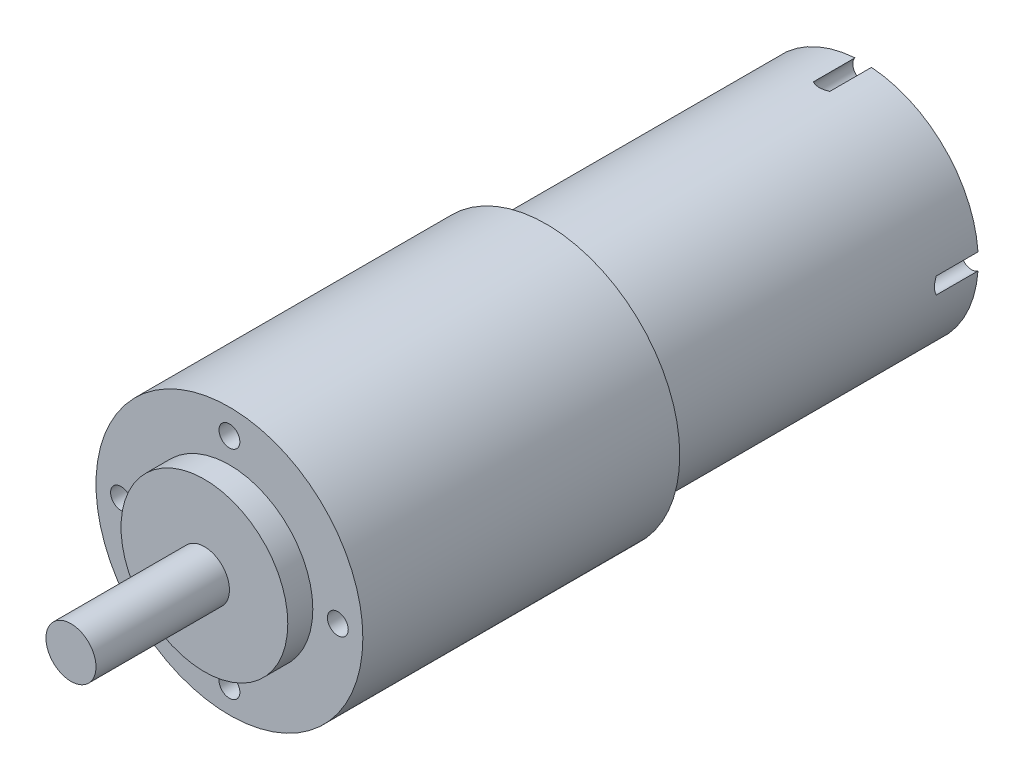
ISO-10303-21;
HEADER;
FILE_DESCRIPTION(('STEP AP214'),'2;1');
FILE_NAME('part.step','',(''),(''),'','','');
FILE_SCHEMA(('AUTOMOTIVE_DESIGN { 1 0 10303 214 1 1 1 1 }'));
ENDSEC;
DATA;
#1=APPLICATION_CONTEXT('core data for automotive mechanical design processes');
#2=APPLICATION_PROTOCOL_DEFINITION('international standard','automotive_design',2000,#1);
#3=PRODUCT_CONTEXT('',#1,'mechanical');
#4=PRODUCT('Part','Part','',(#3));
#5=PRODUCT_RELATED_PRODUCT_CATEGORY('part','',(#4));
#6=PRODUCT_DEFINITION_FORMATION('','',#4);
#7=PRODUCT_DEFINITION_CONTEXT('part definition',#1,'design');
#8=PRODUCT_DEFINITION('design','',#6,#7);
#9=PRODUCT_DEFINITION_SHAPE('','',#8);
#10=(LENGTH_UNIT() NAMED_UNIT(*) SI_UNIT(.MILLI.,.METRE.));
#11=(NAMED_UNIT(*) PLANE_ANGLE_UNIT() SI_UNIT($,.RADIAN.));
#12=(NAMED_UNIT(*) SI_UNIT($,.STERADIAN.) SOLID_ANGLE_UNIT());
#13=UNCERTAINTY_MEASURE_WITH_UNIT(LENGTH_MEASURE(1.E-05),#10,'distance_accuracy_value','');
#14=(GEOMETRIC_REPRESENTATION_CONTEXT(3) GLOBAL_UNCERTAINTY_ASSIGNED_CONTEXT((#13)) GLOBAL_UNIT_ASSIGNED_CONTEXT((#10,
#11,#12)) REPRESENTATION_CONTEXT('',''));
#15=CARTESIAN_POINT('',(0.,0.,0.));
#16=DIRECTION('',(0.,0.,1.));
#17=DIRECTION('',(1.,0.,0.));
#18=AXIS2_PLACEMENT_3D('',#15,#16,#17);
#19=CARTESIAN_POINT('',(0.,0.,38.));
#20=DIRECTION('',(0.,0.,-1.));
#21=DIRECTION('',(-1.,0.,0.));
#22=AXIS2_PLACEMENT_3D('',#19,#20,#21);
#23=CYLINDRICAL_SURFACE('',#22,16.);
#24=CARTESIAN_POINT('',(0.,0.,38.));
#25=DIRECTION('',(0.,0.,1.));
#26=DIRECTION('',(1.,0.,0.));
#27=AXIS2_PLACEMENT_3D('',#24,#25,#26);
#28=CIRCLE('',#27,16.);
#29=CARTESIAN_POINT('',(16.,0.,38.));
#30=VERTEX_POINT('',#29);
#31=EDGE_CURVE('E229',#30,#30,#28,.T.);
#32=ORIENTED_EDGE('',*,*,#31,.F.);
#33=EDGE_LOOP('',(#32));
#34=FACE_BOUND('',#33,.T.);
#35=CARTESIAN_POINT('',(0.,0.,0.));
#36=DIRECTION('',(0.,0.,1.));
#37=DIRECTION('',(1.,0.,0.));
#38=AXIS2_PLACEMENT_3D('',#35,#36,#37);
#39=CIRCLE('',#38,16.);
#40=CARTESIAN_POINT('',(16.,0.,0.));
#41=VERTEX_POINT('',#40);
#42=EDGE_CURVE('E224',#41,#41,#39,.T.);
#43=ORIENTED_EDGE('',*,*,#42,.T.);
#44=EDGE_LOOP('',(#43));
#45=FACE_BOUND('',#44,.T.);
#46=ADVANCED_FACE('F40',(#34,#45),#23,.T.);
#47=CARTESIAN_POINT('',(0.,0.,38.));
#48=DIRECTION('',(0.,0.,1.));
#49=DIRECTION('',(1.,0.,0.));
#50=AXIS2_PLACEMENT_3D('',#47,#48,#49);
#51=PLANE('',#50);
#52=CARTESIAN_POINT('',(0.,13.,38.));
#53=DIRECTION('',(0.,0.,1.));
#54=DIRECTION('',(1.,0.,0.));
#55=AXIS2_PLACEMENT_3D('',#52,#53,#54);
#56=CIRCLE('',#55,1.24999999999999);
#57=CARTESIAN_POINT('',(1.24999999999999,13.,38.));
#58=VERTEX_POINT('',#57);
#59=EDGE_CURVE('E139',#58,#58,#56,.T.);
#60=ORIENTED_EDGE('',*,*,#59,.F.);
#61=EDGE_LOOP('',(#60));
#62=FACE_BOUND('',#61,.T.);
#63=CARTESIAN_POINT('',(-13.,0.,38.));
#64=DIRECTION('',(0.,0.,1.));
#65=DIRECTION('',(1.,0.,0.));
#66=AXIS2_PLACEMENT_3D('',#63,#64,#65);
#67=CIRCLE('',#66,1.24999999999999);
#68=CARTESIAN_POINT('',(-11.75,0.,38.));
#69=VERTEX_POINT('',#68);
#70=EDGE_CURVE('E138',#69,#69,#67,.T.);
#71=ORIENTED_EDGE('',*,*,#70,.F.);
#72=EDGE_LOOP('',(#71));
#73=FACE_BOUND('',#72,.T.);
#74=CARTESIAN_POINT('',(0.,-13.,38.));
#75=DIRECTION('',(0.,0.,1.));
#76=DIRECTION('',(1.,0.,0.));
#77=AXIS2_PLACEMENT_3D('',#74,#75,#76);
#78=CIRCLE('',#77,1.24999999999999);
#79=CARTESIAN_POINT('',(1.24999999999999,-13.,38.));
#80=VERTEX_POINT('',#79);
#81=EDGE_CURVE('E152',#80,#80,#78,.T.);
#82=ORIENTED_EDGE('',*,*,#81,.F.);
#83=EDGE_LOOP('',(#82));
#84=FACE_BOUND('',#83,.T.);
#85=CARTESIAN_POINT('',(13.,0.,38.));
#86=DIRECTION('',(0.,0.,1.));
#87=DIRECTION('',(1.,0.,0.));
#88=AXIS2_PLACEMENT_3D('',#85,#86,#87);
#89=CIRCLE('',#88,1.24999999999999);
#90=CARTESIAN_POINT('',(14.25,0.,38.));
#91=VERTEX_POINT('',#90);
#92=EDGE_CURVE('E160',#91,#91,#89,.T.);
#93=ORIENTED_EDGE('',*,*,#92,.F.);
#94=EDGE_LOOP('',(#93));
#95=FACE_BOUND('',#94,.T.);
#96=CARTESIAN_POINT('',(0.,0.,38.));
#97=DIRECTION('',(0.,0.,1.));
#98=DIRECTION('',(1.,0.,0.));
#99=AXIS2_PLACEMENT_3D('',#96,#97,#98);
#100=CIRCLE('',#99,10.);
#101=CARTESIAN_POINT('',(10.,0.,38.));
#102=VERTEX_POINT('',#101);
#103=EDGE_CURVE('E203',#102,#102,#100,.T.);
#104=ORIENTED_EDGE('',*,*,#103,.F.);
#105=EDGE_LOOP('',(#104));
#106=FACE_BOUND('',#105,.T.);
#107=ORIENTED_EDGE('',*,*,#31,.T.);
#108=EDGE_LOOP('',(#107));
#109=FACE_BOUND('',#108,.T.);
#110=ADVANCED_FACE('F294',(#62,#73,#84,#95,#106,#109),#51,.T.);
#111=CARTESIAN_POINT('',(0.,0.,0.));
#112=DIRECTION('',(0.,0.,1.));
#113=DIRECTION('',(1.,0.,0.));
#114=AXIS2_PLACEMENT_3D('',#111,#112,#113);
#115=PLANE('',#114);
#116=CARTESIAN_POINT('',(0.,0.,0.));
#117=DIRECTION('',(0.,0.,-1.));
#118=DIRECTION('',(-1.,0.,0.));
#119=AXIS2_PLACEMENT_3D('',#116,#117,#118);
#120=CIRCLE('',#119,13.8);
#121=CARTESIAN_POINT('',(-13.8,0.,0.));
#122=VERTEX_POINT('',#121);
#123=EDGE_CURVE('E219',#122,#122,#120,.T.);
#124=ORIENTED_EDGE('',*,*,#123,.F.);
#125=EDGE_LOOP('',(#124));
#126=FACE_BOUND('',#125,.T.);
#127=ORIENTED_EDGE('',*,*,#42,.F.);
#128=EDGE_LOOP('',(#127));
#129=FACE_BOUND('',#128,.T.);
#130=ADVANCED_FACE('F289',(#126,#129),#115,.F.);
#131=CARTESIAN_POINT('',(0.,0.,-38.));
#132=DIRECTION('',(0.,0.,1.));
#133=DIRECTION('',(1.,0.,0.));
#134=AXIS2_PLACEMENT_3D('',#131,#132,#133);
#135=CYLINDRICAL_SURFACE('',#134,13.8);
#136=CARTESIAN_POINT('',(13.7644872211333,-0.989389478040929,-33.0002));
#137=CARTESIAN_POINT('',(13.7665664823169,-0.96046106691949,-32.9872119820903));
#138=CARTESIAN_POINT('',(13.7685608504874,-0.931441624871401,-32.9744136159397));
#139=CARTESIAN_POINT('',(13.7723782546518,-0.873183878608035,-32.9492818372111));
#140=CARTESIAN_POINT('',(13.7742012543098,-0.843945529389668,-32.9369485235702));
#141=CARTESIAN_POINT('',(13.7794254944871,-0.755596743386906,-32.9006725704353));
#142=CARTESIAN_POINT('',(13.7825629092403,-0.696116670041222,-32.8775743899159));
#143=CARTESIAN_POINT('',(13.7880886154033,-0.5763512794133,-32.8348630581675));
#144=CARTESIAN_POINT('',(13.7904821849893,-0.516074954895346,-32.8152258011119));
#145=CARTESIAN_POINT('',(13.794503992416,-0.394165477002278,-32.78085365232));
#146=CARTESIAN_POINT('',(13.7961335456822,-0.332534848375913,-32.7661103474255));
#147=CARTESIAN_POINT('',(13.798243605324,-0.224809881104407,-32.7465365842829));
#148=CARTESIAN_POINT('',(13.7989156010823,-0.179016334825304,-32.7401041459718));
#149=CARTESIAN_POINT('',(13.7998022181188,-0.0870188840995497,-32.7315600219018));
#150=CARTESIAN_POINT('',(13.8000169555805,-0.040815086889218,-32.7294472385797));
#151=CARTESIAN_POINT('',(13.7999809458002,0.0515783069470431,-32.7297986950174));
#152=CARTESIAN_POINT('',(13.7997301571976,0.0977679019464777,-32.7322633414677));
#153=CARTESIAN_POINT('',(13.7987726393195,0.1897097360966,-32.7414712865933));
#154=CARTESIAN_POINT('',(13.7980657816826,0.235461848437034,-32.7482157898315));
#155=CARTESIAN_POINT('',(13.795892516883,0.342223702713093,-32.7682979915394));
#156=CARTESIAN_POINT('',(13.7942464793929,0.40294484983478,-32.783119776325));
#157=CARTESIAN_POINT('',(13.7902146312648,0.523070959201166,-32.8174384296429));
#158=CARTESIAN_POINT('',(13.7878276597291,0.582473698160168,-32.8369426236459));
#159=CARTESIAN_POINT('',(13.7823388612132,0.700459709458859,-32.8792373736964));
#160=CARTESIAN_POINT('',(13.7792327059807,0.759035645111527,-32.9020475017032));
#161=CARTESIAN_POINT('',(13.7740703612279,0.846064241797032,-32.9378380348218));
#162=CARTESIAN_POINT('',(13.7722700867784,0.874874166985876,-32.9500032366427));
#163=CARTESIAN_POINT('',(13.7685030780033,0.932282020714026,-32.9747842441915));
#164=CARTESIAN_POINT('',(13.7665363769739,0.960879990418931,-32.9873999594968));
#165=CARTESIAN_POINT('',(13.7644872211333,0.989389478040927,-33.0002));
#166=B_SPLINE_CURVE_WITH_KNOTS('',3,(#136,#137,#138,#139,#140,#141,#142,#143,#144,#145,#146,
#147,#148,#149,#150,#151,#152,#153,#154,#155,#156,#157,#158,#159,#160,#161,#162,#163,#164,#165),
.UNSPECIFIED.,.F.,.F.,(4,2,2,2,2,2,2,2,2,2,2,2,2,2,4),(0.,0.0953331030288682,0.190686374476015,
0.382265143548266,0.572451714729412,0.762309623545797,0.900876832462357,1.03940882903315,
1.177953134329,1.3165364501364,1.50382257949645,1.69140364327716,1.88014439868571,
1.9741159195618,2.06806868425706),.UNSPECIFIED.);
#167=CARTESIAN_POINT('',(13.7645192307692,-0.98894405594251,-33.));
#168=VERTEX_POINT('',#167);
#169=CARTESIAN_POINT('',(13.7645192307692,0.98894405594251,-33.));
#170=VERTEX_POINT('',#169);
#171=EDGE_CURVE('E484',#168,#170,#166,.T.);
#172=ORIENTED_EDGE('',*,*,#171,.T.);
#173=DIRECTION('',(0.,0.,-1.));
#174=VECTOR('',#173,1.);
#175=CARTESIAN_POINT('',(13.7645192307692,0.98894405594251,-35.5));
#176=LINE('',#175,#174);
#177=CARTESIAN_POINT('',(13.7645192307692,0.988944055942509,-38.));
#178=VERTEX_POINT('',#177);
#179=EDGE_CURVE('E11',#170,#178,#176,.T.);
#180=ORIENTED_EDGE('',*,*,#179,.T.);
#181=CARTESIAN_POINT('',(0.,0.,-38.));
#182=DIRECTION('',(0.,0.,-1.));
#183=DIRECTION('',(-1.,0.,0.));
#184=AXIS2_PLACEMENT_3D('',#181,#182,#183);
#185=CIRCLE('',#184,13.8);
#186=CARTESIAN_POINT('',(0.988944055942509,13.7645192307692,-38.));
#187=VERTEX_POINT('',#186);
#188=EDGE_CURVE('E220',#187,#178,#185,.T.);
#189=ORIENTED_EDGE('',*,*,#188,.F.);
#190=DIRECTION('',(0.,0.,-1.));
#191=VECTOR('',#190,1.);
#192=CARTESIAN_POINT('',(0.98894405594251,13.7645192307692,-35.5));
#193=LINE('',#192,#191);
#194=CARTESIAN_POINT('',(0.988944055942509,13.7645192307692,-33.));
#195=VERTEX_POINT('',#194);
#196=EDGE_CURVE('E245',#187,#195,#193,.F.);
#197=ORIENTED_EDGE('',*,*,#196,.T.);
#198=CARTESIAN_POINT('',(0.989389478040928,13.7644872211333,-33.0002));
#199=CARTESIAN_POINT('',(0.960461066919489,13.7665664823169,-32.9872119820903));
#200=CARTESIAN_POINT('',(0.931441624871401,13.7685608504874,-32.9744136159397));
#201=CARTESIAN_POINT('',(0.873183878608035,13.7723782546518,-32.9492818372111));
#202=CARTESIAN_POINT('',(0.843945529389668,13.7742012543098,-32.9369485235702));
#203=CARTESIAN_POINT('',(0.755596743386906,13.7794254944871,-32.9006725704353));
#204=CARTESIAN_POINT('',(0.696116670041223,13.7825629092403,-32.8775743899159));
#205=CARTESIAN_POINT('',(0.576351279413301,13.7880886154033,-32.8348630581675));
#206=CARTESIAN_POINT('',(0.516074954895348,13.7904821849893,-32.8152258011119));
#207=CARTESIAN_POINT('',(0.394165477002281,13.794503992416,-32.78085365232));
#208=CARTESIAN_POINT('',(0.332534848375915,13.7961335456822,-32.7661103474255));
#209=CARTESIAN_POINT('',(0.224809881104409,13.798243605324,-32.7465365842829));
#210=CARTESIAN_POINT('',(0.179016334825306,13.7989156010823,-32.7401041459718));
#211=CARTESIAN_POINT('',(0.0870188840995515,13.7998022181188,-32.7315600219018));
#212=CARTESIAN_POINT('',(0.0408150868892199,13.8000169555805,-32.7294472385797));
#213=CARTESIAN_POINT('',(-0.0515783069470414,13.7999809458002,-32.7297986950174));
#214=CARTESIAN_POINT('',(-0.0977679019464761,13.7997301571976,-32.7322633414677));
#215=CARTESIAN_POINT('',(-0.189709736096598,13.7987726393195,-32.7414712865933));
#216=CARTESIAN_POINT('',(-0.235461848437032,13.7980657816826,-32.7482157898315));
#217=CARTESIAN_POINT('',(-0.342223702713091,13.795892516883,-32.7682979915394));
#218=CARTESIAN_POINT('',(-0.402944849834779,13.7942464793929,-32.783119776325));
#219=CARTESIAN_POINT('',(-0.523070959201166,13.7902146312648,-32.8174384296429));
#220=CARTESIAN_POINT('',(-0.582473698160169,13.7878276597291,-32.8369426236459));
#221=CARTESIAN_POINT('',(-0.70045970945886,13.7823388612132,-32.8792373736964));
#222=CARTESIAN_POINT('',(-0.759035645111527,13.7792327059807,-32.9020475017032));
#223=CARTESIAN_POINT('',(-0.846064241797032,13.7740703612279,-32.9378380348218));
#224=CARTESIAN_POINT('',(-0.874874166985876,13.7722700867784,-32.9500032366427));
#225=CARTESIAN_POINT('',(-0.932282020714026,13.7685030780033,-32.9747842441915));
#226=CARTESIAN_POINT('',(-0.96087999041893,13.7665363769739,-32.9873999594968));
#227=CARTESIAN_POINT('',(-0.989389478040927,13.7644872211333,-33.0002));
#228=B_SPLINE_CURVE_WITH_KNOTS('',3,(#198,#199,#200,#201,#202,#203,#204,#205,#206,#207,#208,
#209,#210,#211,#212,#213,#214,#215,#216,#217,#218,#219,#220,#221,#222,#223,#224,#225,#226,#227),
.UNSPECIFIED.,.F.,.F.,(4,2,2,2,2,2,2,2,2,2,2,2,2,2,4),(0.,0.095333103028868,0.190686374476015,
0.382265143548266,0.572451714729408,0.762309623545795,0.900876832462355,1.03940882903315,
1.177953134329,1.3165364501364,1.50382257949645,1.69140364327716,1.88014439868571,
1.9741159195618,2.06806868425706),.UNSPECIFIED.);
#229=CARTESIAN_POINT('',(-0.988944055942509,13.7645192307692,-33.));
#230=VERTEX_POINT('',#229);
#231=EDGE_CURVE('E202',#195,#230,#228,.T.);
#232=ORIENTED_EDGE('',*,*,#231,.T.);
#233=DIRECTION('',(0.,0.,-1.));
#234=VECTOR('',#233,1.);
#235=CARTESIAN_POINT('',(-0.98894405594251,13.7645192307692,-35.5));
#236=LINE('',#235,#234);
#237=CARTESIAN_POINT('',(-0.988944055942509,13.7645192307692,-38.));
#238=VERTEX_POINT('',#237);
#239=EDGE_CURVE('E505',#230,#238,#236,.T.);
#240=ORIENTED_EDGE('',*,*,#239,.T.);
#241=CARTESIAN_POINT('',(-13.7645192307692,0.988944055942509,-38.));
#242=VERTEX_POINT('',#241);
#243=EDGE_CURVE('E215',#242,#238,#185,.T.);
#244=ORIENTED_EDGE('',*,*,#243,.F.);
#245=DIRECTION('',(0.,0.,-1.));
#246=VECTOR('',#245,1.);
#247=CARTESIAN_POINT('',(-13.7645192307692,0.98894405594251,-35.5));
#248=LINE('',#247,#246);
#249=CARTESIAN_POINT('',(-13.7645192307692,0.98894405594251,-33.));
#250=VERTEX_POINT('',#249);
#251=EDGE_CURVE('E512',#242,#250,#248,.F.);
#252=ORIENTED_EDGE('',*,*,#251,.T.);
#253=CARTESIAN_POINT('',(-13.7644872211333,0.989389478040929,-33.0002));
#254=CARTESIAN_POINT('',(-13.7665664823169,0.96046106691949,-32.9872119820903));
#255=CARTESIAN_POINT('',(-13.7685608504874,0.931441624871401,-32.9744136159397));
#256=CARTESIAN_POINT('',(-13.7723782546518,0.873183878608035,-32.9492818372111));
#257=CARTESIAN_POINT('',(-13.7742012543098,0.843945529389668,-32.9369485235702));
#258=CARTESIAN_POINT('',(-13.7794254944871,0.755596743386906,-32.9006725704353));
#259=CARTESIAN_POINT('',(-13.7825629092403,0.696116670041222,-32.8775743899159));
#260=CARTESIAN_POINT('',(-13.7880886154033,0.5763512794133,-32.8348630581675));
#261=CARTESIAN_POINT('',(-13.7904821849893,0.516074954895346,-32.8152258011119));
#262=CARTESIAN_POINT('',(-13.794503992416,0.394165477002278,-32.78085365232));
#263=CARTESIAN_POINT('',(-13.7961335456822,0.332534848375913,-32.7661103474255));
#264=CARTESIAN_POINT('',(-13.798243605324,0.224809881104407,-32.7465365842829));
#265=CARTESIAN_POINT('',(-13.7989156010823,0.179016334825304,-32.7401041459718));
#266=CARTESIAN_POINT('',(-13.7998022181188,0.0870188840995497,-32.7315600219018));
#267=CARTESIAN_POINT('',(-13.8000169555805,0.040815086889218,-32.7294472385797));
#268=CARTESIAN_POINT('',(-13.7999809458002,-0.0515783069470431,-32.7297986950174));
#269=CARTESIAN_POINT('',(-13.7997301571976,-0.0977679019464777,-32.7322633414677));
#270=CARTESIAN_POINT('',(-13.7987726393195,-0.1897097360966,-32.7414712865933));
#271=CARTESIAN_POINT('',(-13.7980657816826,-0.235461848437034,-32.7482157898315));
#272=CARTESIAN_POINT('',(-13.795892516883,-0.342223702713093,-32.7682979915394));
#273=CARTESIAN_POINT('',(-13.7942464793929,-0.40294484983478,-32.783119776325));
#274=CARTESIAN_POINT('',(-13.7902146312648,-0.523070959201166,-32.8174384296429));
#275=CARTESIAN_POINT('',(-13.7878276597291,-0.582473698160168,-32.8369426236459));
#276=CARTESIAN_POINT('',(-13.7823388612132,-0.700459709458859,-32.8792373736964));
#277=CARTESIAN_POINT('',(-13.7792327059807,-0.759035645111527,-32.9020475017032));
#278=CARTESIAN_POINT('',(-13.7740703612279,-0.846064241797032,-32.9378380348218));
#279=CARTESIAN_POINT('',(-13.7722700867784,-0.874874166985876,-32.9500032366427));
#280=CARTESIAN_POINT('',(-13.7685030780033,-0.932282020714026,-32.9747842441915));
#281=CARTESIAN_POINT('',(-13.7665363769739,-0.960879990418931,-32.9873999594968));
#282=CARTESIAN_POINT('',(-13.7644872211333,-0.989389478040927,-33.0002));
#283=B_SPLINE_CURVE_WITH_KNOTS('',3,(#253,#254,#255,#256,#257,#258,#259,#260,#261,#262,#263,
#264,#265,#266,#267,#268,#269,#270,#271,#272,#273,#274,#275,#276,#277,#278,#279,#280,#281,#282),
.UNSPECIFIED.,.F.,.F.,(4,2,2,2,2,2,2,2,2,2,2,2,2,2,4),(0.,0.0953331030288682,0.190686374476015,
0.382265143548266,0.572451714729412,0.762309623545797,0.900876832462357,1.03940882903315,
1.177953134329,1.3165364501364,1.50382257949645,1.69140364327716,1.88014439868571,
1.9741159195618,2.06806868425706),.UNSPECIFIED.);
#284=CARTESIAN_POINT('',(-13.7645192307692,-0.98894405594251,-33.));
#285=VERTEX_POINT('',#284);
#286=EDGE_CURVE('E507',#250,#285,#283,.T.);
#287=ORIENTED_EDGE('',*,*,#286,.T.);
#288=DIRECTION('',(0.,0.,-1.));
#289=VECTOR('',#288,1.);
#290=CARTESIAN_POINT('',(-13.7645192307692,-0.98894405594251,-35.5));
#291=LINE('',#290,#289);
#292=CARTESIAN_POINT('',(-13.7645192307692,-0.988944055942509,-38.));
#293=VERTEX_POINT('',#292);
#294=EDGE_CURVE('E533',#285,#293,#291,.T.);
#295=ORIENTED_EDGE('',*,*,#294,.T.);
#296=CARTESIAN_POINT('',(-0.988944055942509,-13.7645192307692,-38.));
#297=VERTEX_POINT('',#296);
#298=EDGE_CURVE('E539',#297,#293,#185,.T.);
#299=ORIENTED_EDGE('',*,*,#298,.F.);
#300=DIRECTION('',(0.,0.,-1.));
#301=VECTOR('',#300,1.);
#302=CARTESIAN_POINT('',(-0.98894405594251,-13.7645192307692,-35.5));
#303=LINE('',#302,#301);
#304=CARTESIAN_POINT('',(-0.988944055942509,-13.7645192307692,-33.));
#305=VERTEX_POINT('',#304);
#306=EDGE_CURVE('E532',#297,#305,#303,.F.);
#307=ORIENTED_EDGE('',*,*,#306,.T.);
#308=CARTESIAN_POINT('',(-0.989389478040928,-13.7644872211333,-33.0002));
#309=CARTESIAN_POINT('',(-0.960461066919489,-13.7665664823169,-32.9872119820903));
#310=CARTESIAN_POINT('',(-0.931441624871401,-13.7685608504874,-32.9744136159397));
#311=CARTESIAN_POINT('',(-0.873183878608035,-13.7723782546518,-32.9492818372111));
#312=CARTESIAN_POINT('',(-0.843945529389668,-13.7742012543098,-32.9369485235702));
#313=CARTESIAN_POINT('',(-0.755596743386906,-13.7794254944871,-32.9006725704353));
#314=CARTESIAN_POINT('',(-0.696116670041223,-13.7825629092403,-32.8775743899159));
#315=CARTESIAN_POINT('',(-0.576351279413301,-13.7880886154033,-32.8348630581675));
#316=CARTESIAN_POINT('',(-0.516074954895348,-13.7904821849893,-32.8152258011119));
#317=CARTESIAN_POINT('',(-0.394165477002281,-13.794503992416,-32.78085365232));
#318=CARTESIAN_POINT('',(-0.332534848375915,-13.7961335456822,-32.7661103474255));
#319=CARTESIAN_POINT('',(-0.224809881104409,-13.798243605324,-32.7465365842829));
#320=CARTESIAN_POINT('',(-0.179016334825306,-13.7989156010823,-32.7401041459718));
#321=CARTESIAN_POINT('',(-0.0870188840995515,-13.7998022181188,-32.7315600219018));
#322=CARTESIAN_POINT('',(-0.0408150868892199,-13.8000169555805,-32.7294472385797));
#323=CARTESIAN_POINT('',(0.0515783069470414,-13.7999809458002,-32.7297986950174));
#324=CARTESIAN_POINT('',(0.0977679019464761,-13.7997301571976,-32.7322633414677));
#325=CARTESIAN_POINT('',(0.189709736096598,-13.7987726393195,-32.7414712865933));
#326=CARTESIAN_POINT('',(0.235461848437032,-13.7980657816826,-32.7482157898315));
#327=CARTESIAN_POINT('',(0.342223702713091,-13.795892516883,-32.7682979915394));
#328=CARTESIAN_POINT('',(0.402944849834779,-13.7942464793929,-32.783119776325));
#329=CARTESIAN_POINT('',(0.523070959201166,-13.7902146312648,-32.8174384296429));
#330=CARTESIAN_POINT('',(0.582473698160169,-13.7878276597291,-32.8369426236459));
#331=CARTESIAN_POINT('',(0.70045970945886,-13.7823388612132,-32.8792373736964));
#332=CARTESIAN_POINT('',(0.759035645111527,-13.7792327059807,-32.9020475017032));
#333=CARTESIAN_POINT('',(0.846064241797032,-13.7740703612279,-32.9378380348218));
#334=CARTESIAN_POINT('',(0.874874166985876,-13.7722700867784,-32.9500032366427));
#335=CARTESIAN_POINT('',(0.932282020714026,-13.7685030780033,-32.9747842441915));
#336=CARTESIAN_POINT('',(0.96087999041893,-13.7665363769739,-32.9873999594968));
#337=CARTESIAN_POINT('',(0.989389478040927,-13.7644872211333,-33.0002));
#338=B_SPLINE_CURVE_WITH_KNOTS('',3,(#308,#309,#310,#311,#312,#313,#314,#315,#316,#317,#318,
#319,#320,#321,#322,#323,#324,#325,#326,#327,#328,#329,#330,#331,#332,#333,#334,#335,#336,#337),
.UNSPECIFIED.,.F.,.F.,(4,2,2,2,2,2,2,2,2,2,2,2,2,2,4),(0.,0.095333103028868,0.190686374476015,
0.382265143548266,0.572451714729408,0.762309623545795,0.900876832462355,1.03940882903315,
1.177953134329,1.3165364501364,1.50382257949645,1.69140364327716,1.88014439868571,
1.9741159195618,2.06806868425706),.UNSPECIFIED.);
#339=CARTESIAN_POINT('',(0.988944055942509,-13.7645192307692,-33.));
#340=VERTEX_POINT('',#339);
#341=EDGE_CURVE('E525',#305,#340,#338,.T.);
#342=ORIENTED_EDGE('',*,*,#341,.T.);
#343=DIRECTION('',(0.,0.,-1.));
#344=VECTOR('',#343,1.);
#345=CARTESIAN_POINT('',(0.98894405594251,-13.7645192307692,-35.5));
#346=LINE('',#345,#344);
#347=CARTESIAN_POINT('',(0.98894405594251,-13.7645192307692,-38.));
#348=VERTEX_POINT('',#347);
#349=EDGE_CURVE('E492',#340,#348,#346,.T.);
#350=ORIENTED_EDGE('',*,*,#349,.T.);
#351=CARTESIAN_POINT('',(13.7645192307692,-0.988944055942509,-38.));
#352=VERTEX_POINT('',#351);
#353=EDGE_CURVE('E225',#352,#348,#185,.T.);
#354=ORIENTED_EDGE('',*,*,#353,.F.);
#355=DIRECTION('',(0.,0.,-1.));
#356=VECTOR('',#355,1.);
#357=CARTESIAN_POINT('',(13.7645192307692,-0.98894405594251,-35.5));
#358=LINE('',#357,#356);
#359=EDGE_CURVE('E48',#352,#168,#358,.F.);
#360=ORIENTED_EDGE('',*,*,#359,.T.);
#361=EDGE_LOOP('',(#172,#180,#189,#197,#232,#240,#244,#252,#287,#295,#299,#307,#342,#350,#354,#360));
#362=FACE_BOUND('',#361,.T.);
#363=ORIENTED_EDGE('',*,*,#123,.T.);
#364=EDGE_LOOP('',(#363));
#365=FACE_BOUND('',#364,.T.);
#366=ADVANCED_FACE('F247',(#362,#365),#135,.T.);
#367=CARTESIAN_POINT('',(0.,0.,-38.));
#368=DIRECTION('',(0.,0.,-1.));
#369=DIRECTION('',(-1.,0.,0.));
#370=AXIS2_PLACEMENT_3D('',#367,#368,#369);
#371=PLANE('',#370);
#372=CARTESIAN_POINT('',(13.,0.,-38.));
#373=DIRECTION('',(0.,0.,-1.));
#374=DIRECTION('',(-1.,0.,0.));
#375=AXIS2_PLACEMENT_3D('',#372,#373,#374);
#376=CIRCLE('',#375,1.25);
#377=EDGE_CURVE('E168',#352,#178,#376,.T.);
#378=ORIENTED_EDGE('',*,*,#377,.F.);
#379=ORIENTED_EDGE('',*,*,#353,.T.);
#380=CARTESIAN_POINT('',(0.,-13.,-38.));
#381=DIRECTION('',(0.,0.,-1.));
#382=DIRECTION('',(-1.,0.,0.));
#383=AXIS2_PLACEMENT_3D('',#380,#381,#382);
#384=CIRCLE('',#383,1.25);
#385=EDGE_CURVE('E173',#297,#348,#384,.T.);
#386=ORIENTED_EDGE('',*,*,#385,.F.);
#387=ORIENTED_EDGE('',*,*,#298,.T.);
#388=CARTESIAN_POINT('',(-13.,0.,-38.));
#389=DIRECTION('',(0.,0.,-1.));
#390=DIRECTION('',(-1.,0.,0.));
#391=AXIS2_PLACEMENT_3D('',#388,#389,#390);
#392=CIRCLE('',#391,1.25);
#393=EDGE_CURVE('E179',#242,#293,#392,.T.);
#394=ORIENTED_EDGE('',*,*,#393,.F.);
#395=ORIENTED_EDGE('',*,*,#243,.T.);
#396=CARTESIAN_POINT('',(0.,13.,-38.));
#397=DIRECTION('',(0.,0.,-1.));
#398=DIRECTION('',(-1.,0.,0.));
#399=AXIS2_PLACEMENT_3D('',#396,#397,#398);
#400=CIRCLE('',#399,1.25);
#401=EDGE_CURVE('E186',#187,#238,#400,.T.);
#402=ORIENTED_EDGE('',*,*,#401,.F.);
#403=ORIENTED_EDGE('',*,*,#188,.T.);
#404=EDGE_LOOP('',(#378,#379,#386,#387,#394,#395,#402,#403));
#405=FACE_BOUND('',#404,.T.);
#406=CARTESIAN_POINT('',(0.,0.,-38.));
#407=DIRECTION('',(0.,0.,-1.));
#408=DIRECTION('',(-1.,0.,0.));
#409=AXIS2_PLACEMENT_3D('',#406,#407,#408);
#410=CIRCLE('',#409,5.);
#411=CARTESIAN_POINT('',(-5.,0.,-38.));
#412=VERTEX_POINT('',#411);
#413=EDGE_CURVE('E211',#412,#412,#410,.T.);
#414=ORIENTED_EDGE('',*,*,#413,.F.);
#415=EDGE_LOOP('',(#414));
#416=FACE_BOUND('',#415,.T.);
#417=ADVANCED_FACE('F282',(#405,#416),#371,.T.);
#418=CARTESIAN_POINT('',(0.,0.,-40.));
#419=DIRECTION('',(0.,0.,1.));
#420=DIRECTION('',(1.,0.,0.));
#421=AXIS2_PLACEMENT_3D('',#418,#419,#420);
#422=CYLINDRICAL_SURFACE('',#421,5.);
#423=CARTESIAN_POINT('',(0.,0.,-40.));
#424=DIRECTION('',(0.,0.,-1.));
#425=DIRECTION('',(-1.,0.,0.));
#426=AXIS2_PLACEMENT_3D('',#423,#424,#425);
#427=CIRCLE('',#426,5.);
#428=CARTESIAN_POINT('',(-5.,0.,-40.));
#429=VERTEX_POINT('',#428);
#430=EDGE_CURVE('E207',#429,#429,#427,.T.);
#431=ORIENTED_EDGE('',*,*,#430,.F.);
#432=EDGE_LOOP('',(#431));
#433=FACE_BOUND('',#432,.T.);
#434=ORIENTED_EDGE('',*,*,#413,.T.);
#435=EDGE_LOOP('',(#434));
#436=FACE_BOUND('',#435,.T.);
#437=ADVANCED_FACE('F279',(#433,#436),#422,.T.);
#438=CARTESIAN_POINT('',(0.,0.,-40.));
#439=DIRECTION('',(0.,0.,-1.));
#440=DIRECTION('',(-1.,0.,0.));
#441=AXIS2_PLACEMENT_3D('',#438,#439,#440);
#442=PLANE('',#441);
#443=ORIENTED_EDGE('',*,*,#430,.T.);
#444=EDGE_LOOP('',(#443));
#445=FACE_BOUND('',#444,.T.);
#446=ADVANCED_FACE('F275',(#445),#442,.T.);
#447=CARTESIAN_POINT('',(0.,0.,41.));
#448=DIRECTION('',(0.,0.,-1.));
#449=DIRECTION('',(-1.,0.,0.));
#450=AXIS2_PLACEMENT_3D('',#447,#448,#449);
#451=CYLINDRICAL_SURFACE('',#450,10.);
#452=CARTESIAN_POINT('',(0.,0.,41.));
#453=DIRECTION('',(0.,0.,1.));
#454=DIRECTION('',(1.,0.,0.));
#455=AXIS2_PLACEMENT_3D('',#452,#453,#454);
#456=CIRCLE('',#455,10.);
#457=CARTESIAN_POINT('',(10.,0.,41.));
#458=VERTEX_POINT('',#457);
#459=EDGE_CURVE('E197',#458,#458,#456,.T.);
#460=ORIENTED_EDGE('',*,*,#459,.F.);
#461=EDGE_LOOP('',(#460));
#462=FACE_BOUND('',#461,.T.);
#463=ORIENTED_EDGE('',*,*,#103,.T.);
#464=EDGE_LOOP('',(#463));
#465=FACE_BOUND('',#464,.T.);
#466=ADVANCED_FACE('F271',(#462,#465),#451,.T.);
#467=CARTESIAN_POINT('',(0.,0.,41.));
#468=DIRECTION('',(0.,0.,1.));
#469=DIRECTION('',(1.,0.,0.));
#470=AXIS2_PLACEMENT_3D('',#467,#468,#469);
#471=PLANE('',#470);
#472=CARTESIAN_POINT('',(0.,0.,41.));
#473=DIRECTION('',(0.,0.,1.));
#474=DIRECTION('',(1.,0.,0.));
#475=AXIS2_PLACEMENT_3D('',#472,#473,#474);
#476=CIRCLE('',#475,3.);
#477=CARTESIAN_POINT('',(3.,0.,41.));
#478=VERTEX_POINT('',#477);
#479=EDGE_CURVE('E198',#478,#478,#476,.T.);
#480=ORIENTED_EDGE('',*,*,#479,.F.);
#481=EDGE_LOOP('',(#480));
#482=FACE_BOUND('',#481,.T.);
#483=ORIENTED_EDGE('',*,*,#459,.T.);
#484=EDGE_LOOP('',(#483));
#485=FACE_BOUND('',#484,.T.);
#486=ADVANCED_FACE('F267',(#482,#485),#471,.T.);
#487=CARTESIAN_POINT('',(0.,0.,57.));
#488=DIRECTION('',(0.,0.,-1.));
#489=DIRECTION('',(-1.,0.,0.));
#490=AXIS2_PLACEMENT_3D('',#487,#488,#489);
#491=CYLINDRICAL_SURFACE('',#490,3.);
#492=CARTESIAN_POINT('',(0.,0.,57.));
#493=DIRECTION('',(0.,0.,1.));
#494=DIRECTION('',(1.,0.,0.));
#495=AXIS2_PLACEMENT_3D('',#492,#493,#494);
#496=CIRCLE('',#495,3.);
#497=CARTESIAN_POINT('',(3.,0.,57.));
#498=VERTEX_POINT('',#497);
#499=EDGE_CURVE('E193',#498,#498,#496,.T.);
#500=ORIENTED_EDGE('',*,*,#499,.F.);
#501=EDGE_LOOP('',(#500));
#502=FACE_BOUND('',#501,.T.);
#503=ORIENTED_EDGE('',*,*,#479,.T.);
#504=EDGE_LOOP('',(#503));
#505=FACE_BOUND('',#504,.T.);
#506=ADVANCED_FACE('F263',(#502,#505),#491,.T.);
#507=CARTESIAN_POINT('',(0.,0.,57.));
#508=DIRECTION('',(0.,0.,1.));
#509=DIRECTION('',(1.,0.,0.));
#510=AXIS2_PLACEMENT_3D('',#507,#508,#509);
#511=PLANE('',#510);
#512=ORIENTED_EDGE('',*,*,#499,.T.);
#513=EDGE_LOOP('',(#512));
#514=FACE_BOUND('',#513,.T.);
#515=ADVANCED_FACE('F260',(#514),#511,.T.);
#516=CARTESIAN_POINT('',(0.,13.,-38.));
#517=DIRECTION('',(0.,0.,-1.));
#518=DIRECTION('',(-1.,0.,0.));
#519=AXIS2_PLACEMENT_3D('',#516,#517,#518);
#520=CYLINDRICAL_SURFACE('',#519,1.25);
#521=CARTESIAN_POINT('',(0.,13.,-33.));
#522=DIRECTION('',(0.,0.,-1.));
#523=DIRECTION('',(-1.,0.,0.));
#524=AXIS2_PLACEMENT_3D('',#521,#522,#523);
#525=CIRCLE('',#524,1.25);
#526=EDGE_CURVE('E190',#195,#230,#525,.T.);
#527=ORIENTED_EDGE('',*,*,#526,.F.);
#528=ORIENTED_EDGE('',*,*,#196,.F.);
#529=ORIENTED_EDGE('',*,*,#401,.T.);
#530=ORIENTED_EDGE('',*,*,#239,.F.);
#531=EDGE_LOOP('',(#527,#528,#529,#530));
#532=FACE_BOUND('',#531,.T.);
#533=ADVANCED_FACE('F257',(#532),#520,.F.);
#534=CARTESIAN_POINT('',(0.,13.,-33.));
#535=DIRECTION('',(0.,0.,-1.));
#536=DIRECTION('',(-1.,0.,0.));
#537=AXIS2_PLACEMENT_3D('',#534,#535,#536);
#538=CONICAL_SURFACE('',#537,1.25,1.02974425867665);
#539=CARTESIAN_POINT('',(0.,13.,-32.2489242262155));
#540=VERTEX_POINT('',#539);
#541=VERTEX_LOOP('',#540);
#542=FACE_BOUND('',#541,.T.);
#543=ORIENTED_EDGE('',*,*,#526,.T.);
#544=ORIENTED_EDGE('',*,*,#231,.F.);
#545=EDGE_LOOP('',(#543,#544));
#546=FACE_BOUND('',#545,.T.);
#547=ADVANCED_FACE('F251',(#542,#546),#538,.F.);
#548=CARTESIAN_POINT('',(-13.,0.,-38.));
#549=DIRECTION('',(0.,0.,-1.));
#550=DIRECTION('',(-1.,0.,0.));
#551=AXIS2_PLACEMENT_3D('',#548,#549,#550);
#552=CYLINDRICAL_SURFACE('',#551,1.25);
#553=CARTESIAN_POINT('',(-13.,0.,-33.));
#554=DIRECTION('',(0.,0.,-1.));
#555=DIRECTION('',(-1.,0.,0.));
#556=AXIS2_PLACEMENT_3D('',#553,#554,#555);
#557=CIRCLE('',#556,1.25);
#558=EDGE_CURVE('E183',#250,#285,#557,.T.);
#559=ORIENTED_EDGE('',*,*,#558,.F.);
#560=ORIENTED_EDGE('',*,*,#251,.F.);
#561=ORIENTED_EDGE('',*,*,#393,.T.);
#562=ORIENTED_EDGE('',*,*,#294,.F.);
#563=EDGE_LOOP('',(#559,#560,#561,#562));
#564=FACE_BOUND('',#563,.T.);
#565=ADVANCED_FACE('F256',(#564),#552,.F.);
#566=CARTESIAN_POINT('',(-13.,0.,-33.));
#567=DIRECTION('',(0.,0.,-1.));
#568=DIRECTION('',(-1.,0.,0.));
#569=AXIS2_PLACEMENT_3D('',#566,#567,#568);
#570=CONICAL_SURFACE('',#569,1.25,1.02974425867665);
#571=CARTESIAN_POINT('',(-13.,0.,-32.2489242262155));
#572=VERTEX_POINT('',#571);
#573=VERTEX_LOOP('',#572);
#574=FACE_BOUND('',#573,.T.);
#575=ORIENTED_EDGE('',*,*,#558,.T.);
#576=ORIENTED_EDGE('',*,*,#286,.F.);
#577=EDGE_LOOP('',(#575,#576));
#578=FACE_BOUND('',#577,.T.);
#579=ADVANCED_FACE('F362',(#574,#578),#570,.F.);
#580=CARTESIAN_POINT('',(0.,-13.,-38.));
#581=DIRECTION('',(0.,0.,-1.));
#582=DIRECTION('',(-1.,0.,0.));
#583=AXIS2_PLACEMENT_3D('',#580,#581,#582);
#584=CYLINDRICAL_SURFACE('',#583,1.25);
#585=CARTESIAN_POINT('',(0.,-13.,-33.));
#586=DIRECTION('',(0.,0.,-1.));
#587=DIRECTION('',(-1.,0.,0.));
#588=AXIS2_PLACEMENT_3D('',#585,#586,#587);
#589=CIRCLE('',#588,1.25);
#590=EDGE_CURVE('E61',#305,#340,#589,.T.);
#591=ORIENTED_EDGE('',*,*,#590,.F.);
#592=ORIENTED_EDGE('',*,*,#306,.F.);
#593=ORIENTED_EDGE('',*,*,#385,.T.);
#594=ORIENTED_EDGE('',*,*,#349,.F.);
#595=EDGE_LOOP('',(#591,#592,#593,#594));
#596=FACE_BOUND('',#595,.T.);
#597=ADVANCED_FACE('F356',(#596),#584,.F.);
#598=CARTESIAN_POINT('',(0.,-13.,-33.));
#599=DIRECTION('',(0.,0.,-1.));
#600=DIRECTION('',(-1.,0.,0.));
#601=AXIS2_PLACEMENT_3D('',#598,#599,#600);
#602=CONICAL_SURFACE('',#601,1.25,1.02974425867665);
#603=CARTESIAN_POINT('',(0.,-13.,-32.2489242262155));
#604=VERTEX_POINT('',#603);
#605=VERTEX_LOOP('',#604);
#606=FACE_BOUND('',#605,.T.);
#607=ORIENTED_EDGE('',*,*,#590,.T.);
#608=ORIENTED_EDGE('',*,*,#341,.F.);
#609=EDGE_LOOP('',(#607,#608));
#610=FACE_BOUND('',#609,.T.);
#611=ADVANCED_FACE('F361',(#606,#610),#602,.F.);
#612=CARTESIAN_POINT('',(13.,0.,-38.));
#613=DIRECTION('',(0.,0.,-1.));
#614=DIRECTION('',(-1.,0.,0.));
#615=AXIS2_PLACEMENT_3D('',#612,#613,#614);
#616=CYLINDRICAL_SURFACE('',#615,1.25);
#617=CARTESIAN_POINT('',(13.,0.,-33.));
#618=DIRECTION('',(0.,0.,-1.));
#619=DIRECTION('',(-1.,0.,0.));
#620=AXIS2_PLACEMENT_3D('',#617,#618,#619);
#621=CIRCLE('',#620,1.25);
#622=EDGE_CURVE('E54',#168,#170,#621,.T.);
#623=ORIENTED_EDGE('',*,*,#622,.F.);
#624=ORIENTED_EDGE('',*,*,#359,.F.);
#625=ORIENTED_EDGE('',*,*,#377,.T.);
#626=ORIENTED_EDGE('',*,*,#179,.F.);
#627=EDGE_LOOP('',(#623,#624,#625,#626));
#628=FACE_BOUND('',#627,.T.);
#629=ADVANCED_FACE('F372',(#628),#616,.F.);
#630=CARTESIAN_POINT('',(13.,0.,-33.));
#631=DIRECTION('',(0.,0.,-1.));
#632=DIRECTION('',(-1.,0.,0.));
#633=AXIS2_PLACEMENT_3D('',#630,#631,#632);
#634=CONICAL_SURFACE('',#633,1.25,1.02974425867665);
#635=CARTESIAN_POINT('',(13.,0.,-32.2489242262155));
#636=VERTEX_POINT('',#635);
#637=VERTEX_LOOP('',#636);
#638=FACE_BOUND('',#637,.T.);
#639=ORIENTED_EDGE('',*,*,#622,.T.);
#640=ORIENTED_EDGE('',*,*,#171,.F.);
#641=EDGE_LOOP('',(#639,#640));
#642=FACE_BOUND('',#641,.T.);
#643=ADVANCED_FACE('F377',(#638,#642),#634,.F.);
#644=CARTESIAN_POINT('',(13.,0.,33.));
#645=DIRECTION('',(0.,0.,1.));
#646=DIRECTION('',(1.,0.,0.));
#647=AXIS2_PLACEMENT_3D('',#644,#645,#646);
#648=CONICAL_SURFACE('',#647,1.24999999999999,1.02974425867665);
#649=CARTESIAN_POINT('',(13.,0.,32.2489242262155));
#650=VERTEX_POINT('',#649);
#651=VERTEX_LOOP('',#650);
#652=FACE_BOUND('',#651,.T.);
#653=CARTESIAN_POINT('',(13.,0.,33.));
#654=DIRECTION('',(0.,0.,1.));
#655=DIRECTION('',(1.,0.,0.));
#656=AXIS2_PLACEMENT_3D('',#653,#654,#655);
#657=CIRCLE('',#656,1.24999999999999);
#658=CARTESIAN_POINT('',(14.25,0.,33.));
#659=VERTEX_POINT('',#658);
#660=EDGE_CURVE('E164',#659,#659,#657,.T.);
#661=ORIENTED_EDGE('',*,*,#660,.T.);
#662=EDGE_LOOP('',(#661));
#663=FACE_BOUND('',#662,.T.);
#664=ADVANCED_FACE('F406',(#652,#663),#648,.F.);
#665=CARTESIAN_POINT('',(13.,0.,38.));
#666=DIRECTION('',(0.,0.,1.));
#667=DIRECTION('',(1.,0.,0.));
#668=AXIS2_PLACEMENT_3D('',#665,#666,#667);
#669=CYLINDRICAL_SURFACE('',#668,1.24999999999999);
#670=ORIENTED_EDGE('',*,*,#660,.F.);
#671=EDGE_LOOP('',(#670));
#672=FACE_BOUND('',#671,.T.);
#673=ORIENTED_EDGE('',*,*,#92,.T.);
#674=EDGE_LOOP('',(#673));
#675=FACE_BOUND('',#674,.T.);
#676=ADVANCED_FACE('F411',(#672,#675),#669,.F.);
#677=CARTESIAN_POINT('',(0.,-13.,33.));
#678=DIRECTION('',(0.,0.,1.));
#679=DIRECTION('',(1.,0.,0.));
#680=AXIS2_PLACEMENT_3D('',#677,#678,#679);
#681=CONICAL_SURFACE('',#680,1.24999999999999,1.02974425867665);
#682=CARTESIAN_POINT('',(0.,-13.,32.2489242262155));
#683=VERTEX_POINT('',#682);
#684=VERTEX_LOOP('',#683);
#685=FACE_BOUND('',#684,.T.);
#686=CARTESIAN_POINT('',(0.,-13.,33.));
#687=DIRECTION('',(0.,0.,1.));
#688=DIRECTION('',(1.,0.,0.));
#689=AXIS2_PLACEMENT_3D('',#686,#687,#688);
#690=CIRCLE('',#689,1.24999999999999);
#691=CARTESIAN_POINT('',(1.24999999999999,-13.,33.));
#692=VERTEX_POINT('',#691);
#693=EDGE_CURVE('E156',#692,#692,#690,.T.);
#694=ORIENTED_EDGE('',*,*,#693,.T.);
#695=EDGE_LOOP('',(#694));
#696=FACE_BOUND('',#695,.T.);
#697=ADVANCED_FACE('F421',(#685,#696),#681,.F.);
#698=CARTESIAN_POINT('',(0.,-13.,38.));
#699=DIRECTION('',(0.,0.,1.));
#700=DIRECTION('',(1.,0.,0.));
#701=AXIS2_PLACEMENT_3D('',#698,#699,#700);
#702=CYLINDRICAL_SURFACE('',#701,1.24999999999999);
#703=ORIENTED_EDGE('',*,*,#693,.F.);
#704=EDGE_LOOP('',(#703));
#705=FACE_BOUND('',#704,.T.);
#706=ORIENTED_EDGE('',*,*,#81,.T.);
#707=EDGE_LOOP('',(#706));
#708=FACE_BOUND('',#707,.T.);
#709=ADVANCED_FACE('F431',(#705,#708),#702,.F.);
#710=CARTESIAN_POINT('',(-13.,0.,33.));
#711=DIRECTION('',(0.,0.,1.));
#712=DIRECTION('',(1.,0.,0.));
#713=AXIS2_PLACEMENT_3D('',#710,#711,#712);
#714=CONICAL_SURFACE('',#713,1.24999999999999,1.02974425867665);
#715=CARTESIAN_POINT('',(-13.,0.,32.2489242262155));
#716=VERTEX_POINT('',#715);
#717=VERTEX_LOOP('',#716);
#718=FACE_BOUND('',#717,.T.);
#719=CARTESIAN_POINT('',(-13.,0.,33.));
#720=DIRECTION('',(0.,0.,1.));
#721=DIRECTION('',(1.,0.,0.));
#722=AXIS2_PLACEMENT_3D('',#719,#720,#721);
#723=CIRCLE('',#722,1.24999999999999);
#724=CARTESIAN_POINT('',(-11.75,0.,33.));
#725=VERTEX_POINT('',#724);
#726=EDGE_CURVE('E144',#725,#725,#723,.T.);
#727=ORIENTED_EDGE('',*,*,#726,.T.);
#728=EDGE_LOOP('',(#727));
#729=FACE_BOUND('',#728,.T.);
#730=ADVANCED_FACE('F441',(#718,#729),#714,.F.);
#731=CARTESIAN_POINT('',(-13.,0.,38.));
#732=DIRECTION('',(0.,0.,1.));
#733=DIRECTION('',(1.,0.,0.));
#734=AXIS2_PLACEMENT_3D('',#731,#732,#733);
#735=CYLINDRICAL_SURFACE('',#734,1.24999999999999);
#736=ORIENTED_EDGE('',*,*,#726,.F.);
#737=EDGE_LOOP('',(#736));
#738=FACE_BOUND('',#737,.T.);
#739=ORIENTED_EDGE('',*,*,#70,.T.);
#740=EDGE_LOOP('',(#739));
#741=FACE_BOUND('',#740,.T.);
#742=ADVANCED_FACE('F131',(#738,#741),#735,.F.);
#743=CARTESIAN_POINT('',(0.,13.,33.));
#744=DIRECTION('',(0.,0.,1.));
#745=DIRECTION('',(1.,0.,0.));
#746=AXIS2_PLACEMENT_3D('',#743,#744,#745);
#747=CONICAL_SURFACE('',#746,1.24999999999999,1.02974425867665);
#748=CARTESIAN_POINT('',(0.,13.,32.2489242262155));
#749=VERTEX_POINT('',#748);
#750=VERTEX_LOOP('',#749);
#751=FACE_BOUND('',#750,.T.);
#752=CARTESIAN_POINT('',(0.,13.,33.));
#753=DIRECTION('',(0.,0.,1.));
#754=DIRECTION('',(1.,0.,0.));
#755=AXIS2_PLACEMENT_3D('',#752,#753,#754);
#756=CIRCLE('',#755,1.24999999999999);
#757=CARTESIAN_POINT('',(1.24999999999999,13.,33.));
#758=VERTEX_POINT('',#757);
#759=EDGE_CURVE('E135',#758,#758,#756,.T.);
#760=ORIENTED_EDGE('',*,*,#759,.T.);
#761=EDGE_LOOP('',(#760));
#762=FACE_BOUND('',#761,.T.);
#763=ADVANCED_FACE('F127',(#751,#762),#747,.F.);
#764=CARTESIAN_POINT('',(0.,13.,38.));
#765=DIRECTION('',(0.,0.,1.));
#766=DIRECTION('',(1.,0.,0.));
#767=AXIS2_PLACEMENT_3D('',#764,#765,#766);
#768=CYLINDRICAL_SURFACE('',#767,1.24999999999999);
#769=ORIENTED_EDGE('',*,*,#759,.F.);
#770=EDGE_LOOP('',(#769));
#771=FACE_BOUND('',#770,.T.);
#772=ORIENTED_EDGE('',*,*,#59,.T.);
#773=EDGE_LOOP('',(#772));
#774=FACE_BOUND('',#773,.T.);
#775=ADVANCED_FACE('F130',(#771,#774),#768,.F.);
#776=CLOSED_SHELL('',(#46,#110,#130,#366,#417,#437,#446,#466,#486,#506,#515,#533,#547,#565,#579,
#597,#611,#629,#643,#664,#676,#697,#709,#730,#742,#763,#775));
#777=MANIFOLD_SOLID_BREP('B2',#776);
#778=ADVANCED_BREP_SHAPE_REPRESENTATION('',(#18,#777),#14);
#779=SHAPE_DEFINITION_REPRESENTATION(#9,#778);
ENDSEC;
END-ISO-10303-21;
